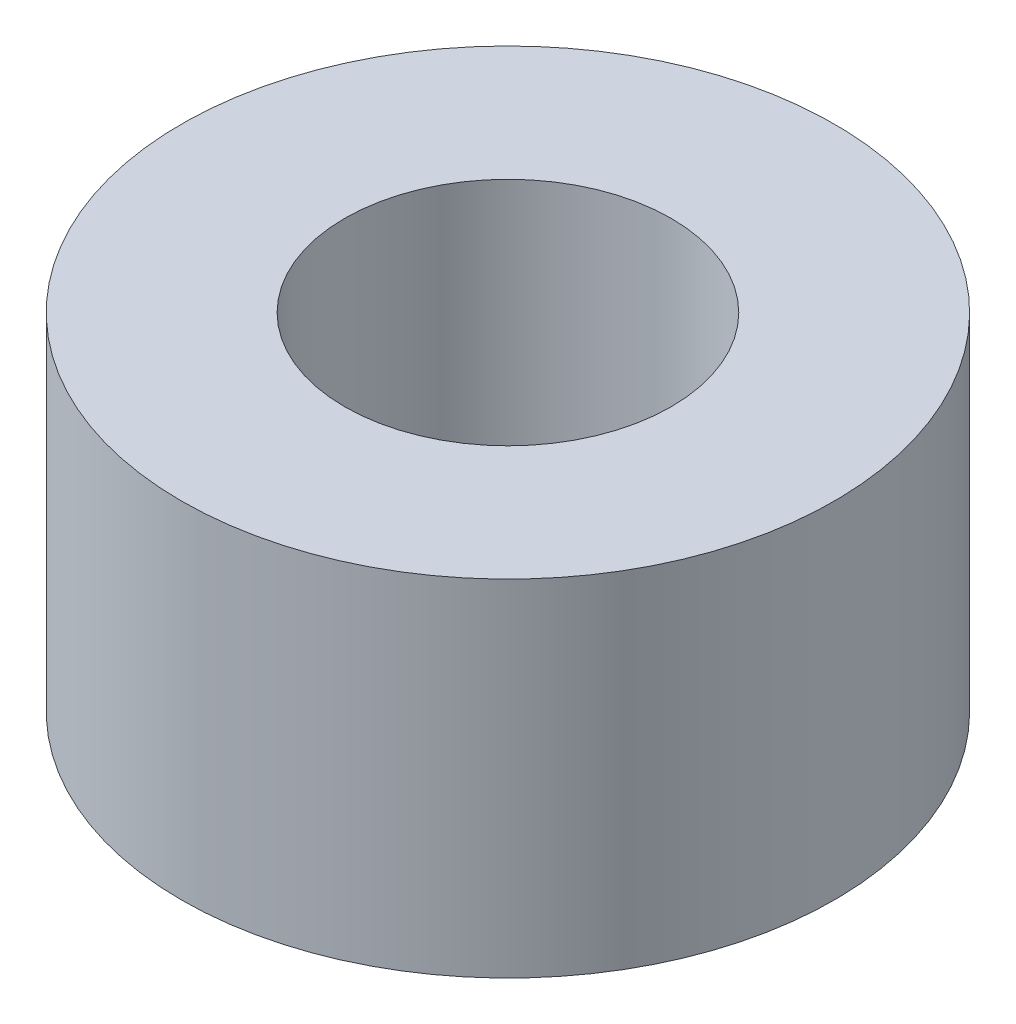
ISO-10303-21;
HEADER;
FILE_DESCRIPTION(('STEP AP214'),'2;1');
FILE_NAME('part.step','',(''),(''),'','','');
FILE_SCHEMA(('AUTOMOTIVE_DESIGN { 1 0 10303 214 1 1 1 1 }'));
ENDSEC;
DATA;
#1=APPLICATION_CONTEXT('core data for automotive mechanical design processes');
#2=APPLICATION_PROTOCOL_DEFINITION('international standard','automotive_design',2000,#1);
#3=PRODUCT_CONTEXT('',#1,'mechanical');
#4=PRODUCT('Part','Part','',(#3));
#5=PRODUCT_RELATED_PRODUCT_CATEGORY('part','',(#4));
#6=PRODUCT_DEFINITION_FORMATION('','',#4);
#7=PRODUCT_DEFINITION_CONTEXT('part definition',#1,'design');
#8=PRODUCT_DEFINITION('design','',#6,#7);
#9=PRODUCT_DEFINITION_SHAPE('','',#8);
#10=(LENGTH_UNIT() NAMED_UNIT(*) SI_UNIT(.MILLI.,.METRE.));
#11=(NAMED_UNIT(*) PLANE_ANGLE_UNIT() SI_UNIT($,.RADIAN.));
#12=(NAMED_UNIT(*) SI_UNIT($,.STERADIAN.) SOLID_ANGLE_UNIT());
#13=UNCERTAINTY_MEASURE_WITH_UNIT(LENGTH_MEASURE(1.E-05),#10,'distance_accuracy_value','');
#14=(GEOMETRIC_REPRESENTATION_CONTEXT(3) GLOBAL_UNCERTAINTY_ASSIGNED_CONTEXT((#13)) GLOBAL_UNIT_ASSIGNED_CONTEXT((#10,
#11,#12)) REPRESENTATION_CONTEXT('',''));
#15=CARTESIAN_POINT('',(0.,0.,0.));
#16=DIRECTION('',(0.,0.,1.));
#17=DIRECTION('',(1.,0.,0.));
#18=AXIS2_PLACEMENT_3D('',#15,#16,#17);
#19=CARTESIAN_POINT('',(0.,3.175,0.));
#20=DIRECTION('',(0.,1.,0.));
#21=DIRECTION('',(0.,0.,1.));
#22=AXIS2_PLACEMENT_3D('',#19,#20,#21);
#23=PLANE('',#22);
#24=CARTESIAN_POINT('',(0.,3.175,0.));
#25=DIRECTION('',(0.,1.,0.));
#26=DIRECTION('',(0.,0.,1.));
#27=AXIS2_PLACEMENT_3D('',#24,#25,#26);
#28=CIRCLE('',#27,6.);
#29=CARTESIAN_POINT('',(0.,3.175,6.));
#30=VERTEX_POINT('',#29);
#31=EDGE_CURVE('E10',#30,#30,#28,.T.);
#32=ORIENTED_EDGE('',*,*,#31,.T.);
#33=EDGE_LOOP('',(#32));
#34=FACE_BOUND('',#33,.T.);
#35=CARTESIAN_POINT('',(0.,3.175,0.));
#36=DIRECTION('',(0.,1.,0.));
#37=DIRECTION('',(0.,0.,1.));
#38=AXIS2_PLACEMENT_3D('',#35,#36,#37);
#39=CIRCLE('',#38,3.);
#40=CARTESIAN_POINT('',(0.,3.175,3.));
#41=VERTEX_POINT('',#40);
#42=EDGE_CURVE('E42',#41,#41,#39,.T.);
#43=ORIENTED_EDGE('',*,*,#42,.F.);
#44=EDGE_LOOP('',(#43));
#45=FACE_BOUND('',#44,.T.);
#46=ADVANCED_FACE('F31',(#34,#45),#23,.T.);
#47=CARTESIAN_POINT('',(0.,-3.175,0.));
#48=DIRECTION('',(0.,1.,0.));
#49=DIRECTION('',(0.,0.,1.));
#50=AXIS2_PLACEMENT_3D('',#47,#48,#49);
#51=PLANE('',#50);
#52=CARTESIAN_POINT('',(0.,-3.175,0.));
#53=DIRECTION('',(0.,1.,0.));
#54=DIRECTION('',(0.,0.,1.));
#55=AXIS2_PLACEMENT_3D('',#52,#53,#54);
#56=CIRCLE('',#55,6.);
#57=CARTESIAN_POINT('',(0.,-3.175,6.));
#58=VERTEX_POINT('',#57);
#59=EDGE_CURVE('E35',#58,#58,#56,.T.);
#60=ORIENTED_EDGE('',*,*,#59,.F.);
#61=EDGE_LOOP('',(#60));
#62=FACE_BOUND('',#61,.T.);
#63=CARTESIAN_POINT('',(0.,-3.175,0.));
#64=DIRECTION('',(0.,1.,0.));
#65=DIRECTION('',(0.,0.,1.));
#66=AXIS2_PLACEMENT_3D('',#63,#64,#65);
#67=CIRCLE('',#66,3.);
#68=CARTESIAN_POINT('',(0.,-3.175,3.));
#69=VERTEX_POINT('',#68);
#70=EDGE_CURVE('E44',#69,#69,#67,.T.);
#71=ORIENTED_EDGE('',*,*,#70,.T.);
#72=EDGE_LOOP('',(#71));
#73=FACE_BOUND('',#72,.T.);
#74=ADVANCED_FACE('F54',(#62,#73),#51,.F.);
#75=CARTESIAN_POINT('',(0.,3.175,0.));
#76=DIRECTION('',(0.,-1.,0.));
#77=DIRECTION('',(0.,0.,-1.));
#78=AXIS2_PLACEMENT_3D('',#75,#76,#77);
#79=CYLINDRICAL_SURFACE('',#78,6.);
#80=ORIENTED_EDGE('',*,*,#31,.F.);
#81=EDGE_LOOP('',(#80));
#82=FACE_BOUND('',#81,.T.);
#83=ORIENTED_EDGE('',*,*,#59,.T.);
#84=EDGE_LOOP('',(#83));
#85=FACE_BOUND('',#84,.T.);
#86=ADVANCED_FACE('F33',(#82,#85),#79,.T.);
#87=CARTESIAN_POINT('',(0.,3.175,0.));
#88=DIRECTION('',(0.,-1.,0.));
#89=DIRECTION('',(0.,0.,-1.));
#90=AXIS2_PLACEMENT_3D('',#87,#88,#89);
#91=CYLINDRICAL_SURFACE('',#90,3.);
#92=ORIENTED_EDGE('',*,*,#42,.T.);
#93=EDGE_LOOP('',(#92));
#94=FACE_BOUND('',#93,.T.);
#95=ORIENTED_EDGE('',*,*,#70,.F.);
#96=EDGE_LOOP('',(#95));
#97=FACE_BOUND('',#96,.T.);
#98=ADVANCED_FACE('F50',(#94,#97),#91,.F.);
#99=CLOSED_SHELL('',(#46,#74,#86,#98));
#100=MANIFOLD_SOLID_BREP('B2',#99);
#101=ADVANCED_BREP_SHAPE_REPRESENTATION('',(#18,#100),#14);
#102=SHAPE_DEFINITION_REPRESENTATION(#9,#101);
ENDSEC;
END-ISO-10303-21;
